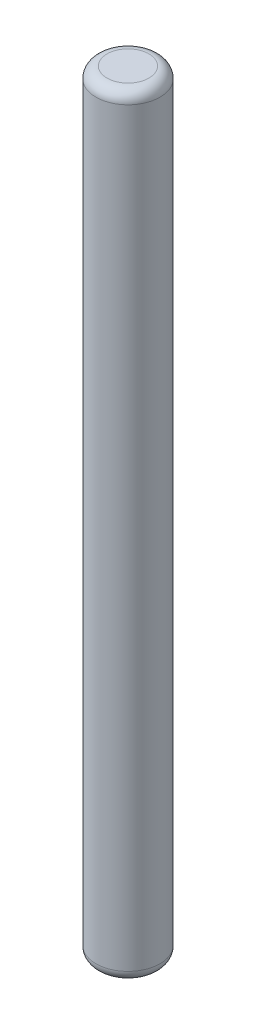
ISO-10303-21;
HEADER;
FILE_DESCRIPTION(('STEP AP214'),'2;1');
FILE_NAME('part.step','',(''),(''),'','','');
FILE_SCHEMA(('AUTOMOTIVE_DESIGN { 1 0 10303 214 1 1 1 1 }'));
ENDSEC;
DATA;
#1=APPLICATION_CONTEXT('core data for automotive mechanical design processes');
#2=APPLICATION_PROTOCOL_DEFINITION('international standard','automotive_design',2000,#1);
#3=PRODUCT_CONTEXT('',#1,'mechanical');
#4=PRODUCT('Part','Part','',(#3));
#5=PRODUCT_RELATED_PRODUCT_CATEGORY('part','',(#4));
#6=PRODUCT_DEFINITION_FORMATION('','',#4);
#7=PRODUCT_DEFINITION_CONTEXT('part definition',#1,'design');
#8=PRODUCT_DEFINITION('design','',#6,#7);
#9=PRODUCT_DEFINITION_SHAPE('','',#8);
#10=(LENGTH_UNIT() NAMED_UNIT(*) SI_UNIT(.MILLI.,.METRE.));
#11=(NAMED_UNIT(*) PLANE_ANGLE_UNIT() SI_UNIT($,.RADIAN.));
#12=(NAMED_UNIT(*) SI_UNIT($,.STERADIAN.) SOLID_ANGLE_UNIT());
#13=UNCERTAINTY_MEASURE_WITH_UNIT(LENGTH_MEASURE(1.E-05),#10,'distance_accuracy_value','');
#14=(GEOMETRIC_REPRESENTATION_CONTEXT(3) GLOBAL_UNCERTAINTY_ASSIGNED_CONTEXT((#13)) GLOBAL_UNIT_ASSIGNED_CONTEXT((#10,
#11,#12)) REPRESENTATION_CONTEXT('',''));
#15=CARTESIAN_POINT('',(0.,0.,0.));
#16=DIRECTION('',(0.,0.,1.));
#17=DIRECTION('',(1.,0.,0.));
#18=AXIS2_PLACEMENT_3D('',#15,#16,#17);
#19=CARTESIAN_POINT('',(0.,35.,0.));
#20=DIRECTION('',(0.,-1.,0.));
#21=DIRECTION('',(0.,0.,-1.));
#22=AXIS2_PLACEMENT_3D('',#19,#20,#21);
#23=CYLINDRICAL_SURFACE('',#22,1.45);
#24=CARTESIAN_POINT('',(0.,34.5,0.));
#25=DIRECTION('',(0.,1.,0.));
#26=DIRECTION('',(0.,0.,1.));
#27=AXIS2_PLACEMENT_3D('',#24,#25,#26);
#28=CIRCLE('',#27,1.45);
#29=CARTESIAN_POINT('',(0.,34.5,1.45));
#30=VERTEX_POINT('',#29);
#31=EDGE_CURVE('E45',#30,#30,#28,.F.);
#32=ORIENTED_EDGE('',*,*,#31,.T.);
#33=EDGE_LOOP('',(#32));
#34=FACE_BOUND('',#33,.T.);
#35=CARTESIAN_POINT('',(0.,0.5,0.));
#36=DIRECTION('',(0.,1.,0.));
#37=DIRECTION('',(0.,0.,1.));
#38=AXIS2_PLACEMENT_3D('',#35,#36,#37);
#39=CIRCLE('',#38,1.45);
#40=CARTESIAN_POINT('',(0.,0.5,1.45));
#41=VERTEX_POINT('',#40);
#42=EDGE_CURVE('E50',#41,#41,#39,.T.);
#43=ORIENTED_EDGE('',*,*,#42,.T.);
#44=EDGE_LOOP('',(#43));
#45=FACE_BOUND('',#44,.T.);
#46=ADVANCED_FACE('F37',(#34,#45),#23,.T.);
#47=CARTESIAN_POINT('',(0.,35.,0.));
#48=DIRECTION('',(0.,1.,0.));
#49=DIRECTION('',(0.,0.,1.));
#50=AXIS2_PLACEMENT_3D('',#47,#48,#49);
#51=PLANE('',#50);
#52=CARTESIAN_POINT('',(0.,35.,0.));
#53=DIRECTION('',(0.,1.,0.));
#54=DIRECTION('',(0.,0.,1.));
#55=AXIS2_PLACEMENT_3D('',#52,#53,#54);
#56=CIRCLE('',#55,0.95);
#57=CARTESIAN_POINT('',(0.,35.,0.95));
#58=VERTEX_POINT('',#57);
#59=EDGE_CURVE('E55',#58,#58,#56,.T.);
#60=ORIENTED_EDGE('',*,*,#59,.T.);
#61=EDGE_LOOP('',(#60));
#62=FACE_BOUND('',#61,.T.);
#63=ADVANCED_FACE('F62',(#62),#51,.T.);
#64=CARTESIAN_POINT('',(0.,0.,0.));
#65=DIRECTION('',(0.,1.,0.));
#66=DIRECTION('',(0.,0.,1.));
#67=AXIS2_PLACEMENT_3D('',#64,#65,#66);
#68=PLANE('',#67);
#69=CARTESIAN_POINT('',(0.,0.,0.));
#70=DIRECTION('',(0.,1.,0.));
#71=DIRECTION('',(0.,0.,1.));
#72=AXIS2_PLACEMENT_3D('',#69,#70,#71);
#73=CIRCLE('',#72,0.95);
#74=CARTESIAN_POINT('',(0.,0.,0.95));
#75=VERTEX_POINT('',#74);
#76=EDGE_CURVE('E10',#75,#75,#73,.F.);
#77=ORIENTED_EDGE('',*,*,#76,.T.);
#78=EDGE_LOOP('',(#77));
#79=FACE_BOUND('',#78,.T.);
#80=ADVANCED_FACE('F66',(#79),#68,.F.);
#81=CARTESIAN_POINT('',(0.,34.5,0.));
#82=DIRECTION('',(0.,1.,0.));
#83=DIRECTION('',(0.,0.,1.));
#84=AXIS2_PLACEMENT_3D('',#81,#82,#83);
#85=TOROIDAL_SURFACE('',#84,0.95,0.5);
#86=ORIENTED_EDGE('',*,*,#31,.F.);
#87=EDGE_LOOP('',(#86));
#88=FACE_BOUND('',#87,.T.);
#89=ORIENTED_EDGE('',*,*,#59,.F.);
#90=EDGE_LOOP('',(#89));
#91=FACE_BOUND('',#90,.T.);
#92=ADVANCED_FACE('F64',(#88,#91),#85,.T.);
#93=CARTESIAN_POINT('',(0.,0.5,0.));
#94=DIRECTION('',(0.,1.,0.));
#95=DIRECTION('',(0.,0.,1.));
#96=AXIS2_PLACEMENT_3D('',#93,#94,#95);
#97=TOROIDAL_SURFACE('',#96,0.95,0.5);
#98=ORIENTED_EDGE('',*,*,#76,.F.);
#99=EDGE_LOOP('',(#98));
#100=FACE_BOUND('',#99,.T.);
#101=ORIENTED_EDGE('',*,*,#42,.F.);
#102=EDGE_LOOP('',(#101));
#103=FACE_BOUND('',#102,.T.);
#104=ADVANCED_FACE('F39',(#100,#103),#97,.T.);
#105=CLOSED_SHELL('',(#46,#63,#80,#92,#104));
#106=MANIFOLD_SOLID_BREP('B2',#105);
#107=ADVANCED_BREP_SHAPE_REPRESENTATION('',(#18,#106),#14);
#108=SHAPE_DEFINITION_REPRESENTATION(#9,#107);
ENDSEC;
END-ISO-10303-21;
